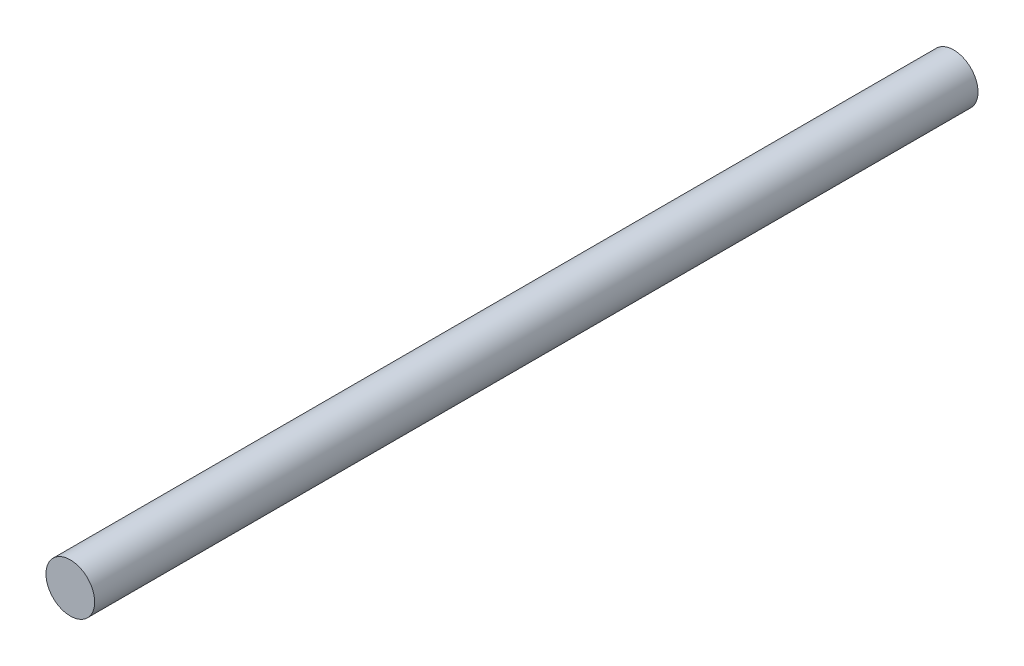
ISO-10303-21;
HEADER;
FILE_DESCRIPTION(('STEP AP214'),'2;1');
FILE_NAME('part.step','',(''),(''),'','','');
FILE_SCHEMA(('AUTOMOTIVE_DESIGN { 1 0 10303 214 1 1 1 1 }'));
ENDSEC;
DATA;
#1=APPLICATION_CONTEXT('core data for automotive mechanical design processes');
#2=APPLICATION_PROTOCOL_DEFINITION('international standard','automotive_design',2000,#1);
#3=PRODUCT_CONTEXT('',#1,'mechanical');
#4=PRODUCT('Part','Part','',(#3));
#5=PRODUCT_RELATED_PRODUCT_CATEGORY('part','',(#4));
#6=PRODUCT_DEFINITION_FORMATION('','',#4);
#7=PRODUCT_DEFINITION_CONTEXT('part definition',#1,'design');
#8=PRODUCT_DEFINITION('design','',#6,#7);
#9=PRODUCT_DEFINITION_SHAPE('','',#8);
#10=(LENGTH_UNIT() NAMED_UNIT(*) SI_UNIT(.MILLI.,.METRE.));
#11=(NAMED_UNIT(*) PLANE_ANGLE_UNIT() SI_UNIT($,.RADIAN.));
#12=(NAMED_UNIT(*) SI_UNIT($,.STERADIAN.) SOLID_ANGLE_UNIT());
#13=UNCERTAINTY_MEASURE_WITH_UNIT(LENGTH_MEASURE(1.E-05),#10,'distance_accuracy_value','');
#14=(GEOMETRIC_REPRESENTATION_CONTEXT(3) GLOBAL_UNCERTAINTY_ASSIGNED_CONTEXT((#13)) GLOBAL_UNIT_ASSIGNED_CONTEXT((#10,
#11,#12)) REPRESENTATION_CONTEXT('',''));
#15=CARTESIAN_POINT('',(0.,0.,0.));
#16=DIRECTION('',(0.,0.,1.));
#17=DIRECTION('',(1.,0.,0.));
#18=AXIS2_PLACEMENT_3D('',#15,#16,#17);
#19=CARTESIAN_POINT('',(0.,0.,725.));
#20=DIRECTION('',(0.,0.,-1.));
#21=DIRECTION('',(-1.,0.,0.));
#22=AXIS2_PLACEMENT_3D('',#19,#20,#21);
#23=CYLINDRICAL_SURFACE('',#22,20.);
#24=CARTESIAN_POINT('',(0.,0.,725.));
#25=DIRECTION('',(0.,0.,1.));
#26=DIRECTION('',(1.,0.,0.));
#27=AXIS2_PLACEMENT_3D('',#24,#25,#26);
#28=CIRCLE('',#27,20.);
#29=CARTESIAN_POINT('',(20.,0.,725.));
#30=VERTEX_POINT('',#29);
#31=EDGE_CURVE('E10',#30,#30,#28,.T.);
#32=ORIENTED_EDGE('',*,*,#31,.F.);
#33=EDGE_LOOP('',(#32));
#34=FACE_BOUND('',#33,.T.);
#35=CARTESIAN_POINT('',(0.,0.,0.));
#36=DIRECTION('',(0.,0.,1.));
#37=DIRECTION('',(1.,0.,0.));
#38=AXIS2_PLACEMENT_3D('',#35,#36,#37);
#39=CIRCLE('',#38,20.);
#40=CARTESIAN_POINT('',(20.,0.,0.));
#41=VERTEX_POINT('',#40);
#42=EDGE_CURVE('E37',#41,#41,#39,.T.);
#43=ORIENTED_EDGE('',*,*,#42,.T.);
#44=EDGE_LOOP('',(#43));
#45=FACE_BOUND('',#44,.T.);
#46=ADVANCED_FACE('F40',(#34,#45),#23,.T.);
#47=CARTESIAN_POINT('',(0.,0.,725.));
#48=DIRECTION('',(0.,0.,1.));
#49=DIRECTION('',(1.,0.,0.));
#50=AXIS2_PLACEMENT_3D('',#47,#48,#49);
#51=PLANE('',#50);
#52=ORIENTED_EDGE('',*,*,#31,.T.);
#53=EDGE_LOOP('',(#52));
#54=FACE_BOUND('',#53,.T.);
#55=ADVANCED_FACE('F55',(#54),#51,.T.);
#56=CARTESIAN_POINT('',(0.,0.,0.));
#57=DIRECTION('',(0.,0.,1.));
#58=DIRECTION('',(1.,0.,0.));
#59=AXIS2_PLACEMENT_3D('',#56,#57,#58);
#60=PLANE('',#59);
#61=ORIENTED_EDGE('',*,*,#42,.F.);
#62=EDGE_LOOP('',(#61));
#63=FACE_BOUND('',#62,.T.);
#64=ADVANCED_FACE('F49',(#63),#60,.F.);
#65=CLOSED_SHELL('',(#46,#55,#64));
#66=MANIFOLD_SOLID_BREP('B2',#65);
#67=ADVANCED_BREP_SHAPE_REPRESENTATION('',(#18,#66),#14);
#68=SHAPE_DEFINITION_REPRESENTATION(#9,#67);
ENDSEC;
END-ISO-10303-21;
